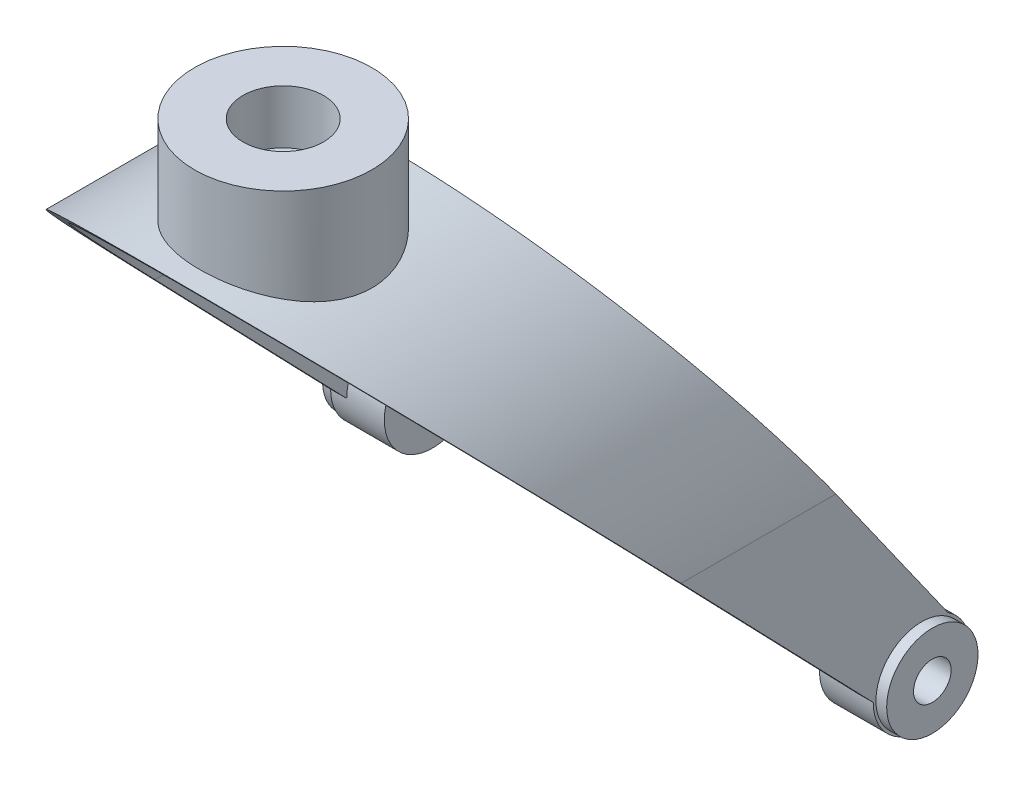
ISO-10303-21;
HEADER;
FILE_DESCRIPTION(('STEP AP214'),'2;1');
FILE_NAME('part.step','',(''),(''),'','','');
FILE_SCHEMA(('AUTOMOTIVE_DESIGN { 1 0 10303 214 1 1 1 1 }'));
ENDSEC;
DATA;
#1=APPLICATION_CONTEXT('core data for automotive mechanical design processes');
#2=APPLICATION_PROTOCOL_DEFINITION('international standard','automotive_design',2000,#1);
#3=PRODUCT_CONTEXT('',#1,'mechanical');
#4=PRODUCT('Part','Part','',(#3));
#5=PRODUCT_RELATED_PRODUCT_CATEGORY('part','',(#4));
#6=PRODUCT_DEFINITION_FORMATION('','',#4);
#7=PRODUCT_DEFINITION_CONTEXT('part definition',#1,'design');
#8=PRODUCT_DEFINITION('design','',#6,#7);
#9=PRODUCT_DEFINITION_SHAPE('','',#8);
#10=(LENGTH_UNIT() NAMED_UNIT(*) SI_UNIT(.MILLI.,.METRE.));
#11=(NAMED_UNIT(*) PLANE_ANGLE_UNIT() SI_UNIT($,.RADIAN.));
#12=(NAMED_UNIT(*) SI_UNIT($,.STERADIAN.) SOLID_ANGLE_UNIT());
#13=UNCERTAINTY_MEASURE_WITH_UNIT(LENGTH_MEASURE(1.E-05),#10,'distance_accuracy_value','');
#14=(GEOMETRIC_REPRESENTATION_CONTEXT(3) GLOBAL_UNCERTAINTY_ASSIGNED_CONTEXT((#13)) GLOBAL_UNIT_ASSIGNED_CONTEXT((#10,
#11,#12)) REPRESENTATION_CONTEXT('',''));
#15=CARTESIAN_POINT('',(0.,0.,0.));
#16=DIRECTION('',(0.,0.,1.));
#17=DIRECTION('',(1.,0.,0.));
#18=AXIS2_PLACEMENT_3D('',#15,#16,#17);
#19=CARTESIAN_POINT('',(-21.3589278020558,9.46327014218011,9.));
#20=DIRECTION('',(-1.,0.,0.));
#21=DIRECTION('',(0.,-1.,0.));
#22=AXIS2_PLACEMENT_3D('',#19,#20,#21);
#23=CYLINDRICAL_SURFACE('',#22,9.);
#24=CARTESIAN_POINT('',(-21.3589278020558,9.46327014218011,9.));
#25=DIRECTION('',(1.,0.,0.));
#26=DIRECTION('',(0.,1.,0.));
#27=AXIS2_PLACEMENT_3D('',#24,#25,#26);
#28=CIRCLE('',#27,9.);
#29=CARTESIAN_POINT('',(-21.3589278020558,18.4632701421801,9.));
#30=VERTEX_POINT('',#29);
#31=EDGE_CURVE('E520',#30,#30,#28,.T.);
#32=ORIENTED_EDGE('',*,*,#31,.F.);
#33=EDGE_LOOP('',(#32));
#34=FACE_BOUND('',#33,.T.);
#35=DIRECTION('',(-1.,0.,0.));
#36=VECTOR('',#35,1.);
#37=CARTESIAN_POINT('',(-21.3589278020558,17.0181657374201,4.10882912330557));
#38=LINE('',#37,#36);
#39=CARTESIAN_POINT('',(-31.3589278020558,17.0181657374201,4.10882912330557));
#40=VERTEX_POINT('',#39);
#41=CARTESIAN_POINT('',(-28.3589278020558,17.0181657374201,4.10882912330557));
#42=VERTEX_POINT('',#41);
#43=EDGE_CURVE('E142',#40,#42,#38,.F.);
#44=ORIENTED_EDGE('',*,*,#43,.T.);
#45=CARTESIAN_POINT('',(-28.3589278020558,9.46327014218011,9.));
#46=DIRECTION('',(-1.,0.,0.));
#47=DIRECTION('',(0.,-1.,0.));
#48=AXIS2_PLACEMENT_3D('',#45,#46,#47);
#49=CIRCLE('',#48,9.);
#50=CARTESIAN_POINT('',(-28.3589278020558,9.4632701421801,18.));
#51=VERTEX_POINT('',#50);
#52=EDGE_CURVE('E518',#42,#51,#49,.F.);
#53=ORIENTED_EDGE('',*,*,#52,.T.);
#54=DIRECTION('',(1.,0.,0.));
#55=VECTOR('',#54,1.);
#56=CARTESIAN_POINT('',(-71.3589278020558,9.4632701421801,18.));
#57=LINE('',#56,#55);
#58=CARTESIAN_POINT('',(-31.3589278020558,9.46327014218009,18.));
#59=VERTEX_POINT('',#58);
#60=EDGE_CURVE('E501',#59,#51,#57,.T.);
#61=ORIENTED_EDGE('',*,*,#60,.F.);
#62=CARTESIAN_POINT('',(-31.3589278020558,9.46327014218011,9.));
#63=DIRECTION('',(1.,0.,0.));
#64=DIRECTION('',(0.,1.,0.));
#65=AXIS2_PLACEMENT_3D('',#62,#63,#64);
#66=CIRCLE('',#65,9.);
#67=EDGE_CURVE('E521',#59,#40,#66,.T.);
#68=ORIENTED_EDGE('',*,*,#67,.T.);
#69=EDGE_LOOP('',(#44,#53,#61,#68));
#70=FACE_BOUND('',#69,.T.);
#71=ADVANCED_FACE('F37',(#34,#70),#23,.T.);
#72=CARTESIAN_POINT('',(-31.3589278020558,46.5431107748374,100.));
#73=DIRECTION('',(1.,0.,0.));
#74=DIRECTION('',(0.,0.,-1.));
#75=AXIS2_PLACEMENT_3D('',#72,#73,#74);
#76=PLANE('',#75);
#77=DIRECTION('',(0.,0.816967863264762,0.576683197598655));
#78=VECTOR('',#77,1.);
#79=CARTESIAN_POINT('',(-31.3589278020558,3.72382153587565,-5.2754138424905));
#80=LINE('',#79,#78);
#81=CARTESIAN_POINT('',(-31.3589278020558,46.5431107748374,24.9499667967766));
#82=VERTEX_POINT('',#81);
#83=EDGE_CURVE('E60',#40,#82,#80,.T.);
#84=ORIENTED_EDGE('',*,*,#83,.F.);
#85=ORIENTED_EDGE('',*,*,#67,.F.);
#86=DIRECTION('',(0.,0.719693182251275,0.694292246407112));
#87=VECTOR('',#86,1.);
#88=CARTESIAN_POINT('',(-31.3589278020558,69.6426269828819,76.0553795404417));
#89=LINE('',#88,#87);
#90=CARTESIAN_POINT('',(-31.3589278020558,46.5431107748374,53.7711403750341));
#91=VERTEX_POINT('',#90);
#92=EDGE_CURVE('E492',#59,#91,#89,.T.);
#93=ORIENTED_EDGE('',*,*,#92,.T.);
#94=DIRECTION('',(0.,0.,-1.));
#95=VECTOR('',#94,1.);
#96=CARTESIAN_POINT('',(-31.3589278020558,46.5431107748374,100.));
#97=LINE('',#96,#95);
#98=EDGE_CURVE('E485',#91,#82,#97,.T.);
#99=ORIENTED_EDGE('',*,*,#98,.T.);
#100=EDGE_LOOP('',(#84,#85,#93,#99));
#101=FACE_BOUND('',#100,.T.);
#102=CARTESIAN_POINT('',(-31.3589278020558,9.46327014218011,9.));
#103=DIRECTION('',(1.,0.,0.));
#104=DIRECTION('',(0.,1.,0.));
#105=AXIS2_PLACEMENT_3D('',#102,#103,#104);
#106=CIRCLE('',#105,8.5);
#107=CARTESIAN_POINT('',(-31.3589278020558,17.9632701421801,9.));
#108=VERTEX_POINT('',#107);
#109=EDGE_CURVE('E526',#108,#108,#106,.T.);
#110=ORIENTED_EDGE('',*,*,#109,.T.);
#111=EDGE_LOOP('',(#110));
#112=FACE_BOUND('',#111,.T.);
#113=ADVANCED_FACE('F186',(#101,#112),#76,.F.);
#114=CARTESIAN_POINT('',(0.,3.72382153587565,-5.2754138424905));
#115=DIRECTION('',(0.,0.576683197598655,-0.816967863264762));
#116=DIRECTION('',(0.,0.816967863264762,0.576683197598655));
#117=AXIS2_PLACEMENT_3D('',#114,#115,#116);
#118=PLANE('',#117);
#119=ORIENTED_EDGE('',*,*,#83,.T.);
#120=CARTESIAN_POINT('',(19.1410721979442,43.8938256977357,23.0798832129401));
#121=DIRECTION('',(0.,0.576683197598655,-0.816967863264762));
#122=DIRECTION('',(0.,-0.816967863264762,-0.576683197598655));
#123=AXIS2_PLACEMENT_3D('',#120,#121,#122);
#124=ELLIPSE('',#123,61.8989396258002,50.5694444444444);
#125=CARTESIAN_POINT('',(69.6410721979442,46.5431107748371,24.9499667967764));
#126=VERTEX_POINT('',#125);
#127=EDGE_CURVE('E12',#82,#126,#124,.T.);
#128=ORIENTED_EDGE('',*,*,#127,.T.);
#129=DIRECTION('',(0.,-0.816967863264762,-0.576683197598655));
#130=VECTOR('',#129,1.);
#131=CARTESIAN_POINT('',(69.6410721979442,3.72382153587566,-5.27541384249051));
#132=LINE('',#131,#130);
#133=CARTESIAN_POINT('',(69.6410721979442,17.0181657374201,4.10882912330555));
#134=VERTEX_POINT('',#133);
#135=EDGE_CURVE('E126',#126,#134,#132,.T.);
#136=ORIENTED_EDGE('',*,*,#135,.T.);
#137=DIRECTION('',(-1.,0.,0.));
#138=VECTOR('',#137,1.);
#139=CARTESIAN_POINT('',(-21.3589278020558,17.0181657374201,4.10882912330557));
#140=LINE('',#139,#138);
#141=CARTESIAN_POINT('',(66.6410721979442,17.0181657374201,4.10882912330557));
#142=VERTEX_POINT('',#141);
#143=EDGE_CURVE('E134',#134,#142,#140,.T.);
#144=ORIENTED_EDGE('',*,*,#143,.T.);
#145=DIRECTION('',(0.,0.816967863264762,0.576683197598655));
#146=VECTOR('',#145,1.);
#147=CARTESIAN_POINT('',(66.6410721979442,3.72382153587566,-5.2754138424905));
#148=LINE('',#147,#146);
#149=CARTESIAN_POINT('',(66.6410721979442,47.0399533397788,25.3006791955587));
#150=VERTEX_POINT('',#149);
#151=EDGE_CURVE('E116',#142,#150,#148,.T.);
#152=ORIENTED_EDGE('',*,*,#151,.T.);
#153=CARTESIAN_POINT('',(19.1410721979442,26.7326091820951,10.9660833195467));
#154=DIRECTION('',(0.,0.576683197598655,-0.816967863264762));
#155=DIRECTION('',(0.,0.816967863264762,0.576683197598655));
#156=AXIS2_PLACEMENT_3D('',#153,#154,#155);
#157=CIRCLE('',#156,53.6108092241405);
#158=CARTESIAN_POINT('',(-28.3589278020558,47.0399533397788,25.3006791955588));
#159=VERTEX_POINT('',#158);
#160=EDGE_CURVE('E165',#159,#150,#157,.T.);
#161=ORIENTED_EDGE('',*,*,#160,.F.);
#162=DIRECTION('',(0.,-0.816967863264762,-0.576683197598655));
#163=VECTOR('',#162,1.);
#164=CARTESIAN_POINT('',(-28.3589278020558,3.72382153587564,-5.2754138424905));
#165=LINE('',#164,#163);
#166=EDGE_CURVE('E52',#159,#42,#165,.T.);
#167=ORIENTED_EDGE('',*,*,#166,.T.);
#168=ORIENTED_EDGE('',*,*,#43,.F.);
#169=EDGE_LOOP('',(#119,#128,#136,#144,#152,#161,#167,#168));
#170=FACE_BOUND('',#169,.T.);
#171=ADVANCED_FACE('F140',(#170),#118,.T.);
#172=CARTESIAN_POINT('',(19.1410721979442,43.8938256977357,100.));
#173=DIRECTION('',(0.,0.,-1.));
#174=DIRECTION('',(-1.,0.,0.));
#175=AXIS2_PLACEMENT_3D('',#172,#173,#174);
#176=CYLINDRICAL_SURFACE('',#175,47.5694444444444);
#177=CARTESIAN_POINT('',(19.1410721979442,43.8938256977357,25.5279599243148));
#178=DIRECTION('',(0.,0.576683197598655,-0.816967863264762));
#179=DIRECTION('',(0.,-0.816967863264762,-0.576683197598655));
#180=AXIS2_PLACEMENT_3D('',#177,#178,#179);
#181=ELLIPSE('',#180,58.2268245587381,47.5694444444444);
#182=CARTESIAN_POINT('',(66.6410721979442,46.4632701421801,27.3416854145108));
#183=VERTEX_POINT('',#182);
#184=CARTESIAN_POINT('',(-28.3589278020558,46.4632701421801,27.3416854145109));
#185=VERTEX_POINT('',#184);
#186=EDGE_CURVE('E471',#183,#185,#181,.F.);
#187=ORIENTED_EDGE('',*,*,#186,.F.);
#188=DIRECTION('',(0.,0.,-1.));
#189=VECTOR('',#188,1.);
#190=CARTESIAN_POINT('',(66.6410721979442,46.4632701421801,100.));
#191=LINE('',#190,#189);
#192=CARTESIAN_POINT('',(66.6410721979442,46.4632701421801,53.6941176470588));
#193=VERTEX_POINT('',#192);
#194=EDGE_CURVE('E474',#193,#183,#191,.T.);
#195=ORIENTED_EDGE('',*,*,#194,.F.);
#196=CARTESIAN_POINT('',(19.1410721979442,43.8938256977357,51.2153594771242));
#197=DIRECTION('',(0.,0.694292246407112,-0.719693182251275));
#198=DIRECTION('',(0.,-0.719693182251275,-0.694292246407112));
#199=AXIS2_PLACEMENT_3D('',#196,#197,#198);
#200=ELLIPSE('',#199,66.0968390663954,47.5694444444444);
#201=CARTESIAN_POINT('',(-28.3589278020558,46.4632701421801,53.6941176470588));
#202=VERTEX_POINT('',#201);
#203=EDGE_CURVE('E496',#193,#202,#200,.F.);
#204=ORIENTED_EDGE('',*,*,#203,.T.);
#205=DIRECTION('',(0.,0.,-1.));
#206=VECTOR('',#205,1.);
#207=CARTESIAN_POINT('',(-28.3589278020558,46.4632701421801,100.));
#208=LINE('',#207,#206);
#209=EDGE_CURVE('E476',#202,#185,#208,.T.);
#210=ORIENTED_EDGE('',*,*,#209,.T.);
#211=EDGE_LOOP('',(#187,#195,#204,#210));
#212=FACE_BOUND('',#211,.T.);
#213=ADVANCED_FACE('F39',(#212),#176,.F.);
#214=CARTESIAN_POINT('',(-28.3589278020558,46.4632701421801,100.));
#215=DIRECTION('',(-1.,0.,0.));
#216=DIRECTION('',(0.,-1.,0.));
#217=AXIS2_PLACEMENT_3D('',#214,#215,#216);
#218=PLANE('',#217);
#219=ORIENTED_EDGE('',*,*,#52,.F.);
#220=ORIENTED_EDGE('',*,*,#166,.F.);
#221=DIRECTION('',(0.,-0.576683197598655,0.816967863264762));
#222=VECTOR('',#221,1.);
#223=CARTESIAN_POINT('',(-28.3589278020558,47.0399533397788,25.3006791955588));
#224=LINE('',#223,#222);
#225=CARTESIAN_POINT('',(-28.3589278020558,45.8865869445815,26.9346149220883));
#226=VERTEX_POINT('',#225);
#227=EDGE_CURVE('E479',#159,#226,#224,.T.);
#228=ORIENTED_EDGE('',*,*,#227,.T.);
#229=DIRECTION('',(0.,-0.816967863264762,-0.576683197598655));
#230=VECTOR('',#229,1.);
#231=CARTESIAN_POINT('',(-28.3589278020558,80.6949010323413,51.5051895722717));
#232=LINE('',#231,#230);
#233=EDGE_CURVE('E537',#185,#226,#232,.T.);
#234=ORIENTED_EDGE('',*,*,#233,.F.);
#235=ORIENTED_EDGE('',*,*,#209,.F.);
#236=DIRECTION('',(0.,-0.719693182251275,-0.694292246407112));
#237=VECTOR('',#236,1.);
#238=CARTESIAN_POINT('',(-28.3589278020558,69.6012728663897,76.0154849810022));
#239=LINE('',#238,#237);
#240=EDGE_CURVE('E498',#202,#51,#239,.T.);
#241=ORIENTED_EDGE('',*,*,#240,.T.);
#242=EDGE_LOOP('',(#219,#220,#228,#234,#235,#241));
#243=FACE_BOUND('',#242,.T.);
#244=ADVANCED_FACE('F223',(#243),#218,.F.);
#245=CARTESIAN_POINT('',(66.6410721979442,46.4632701421801,100.));
#246=DIRECTION('',(1.,0.,0.));
#247=DIRECTION('',(0.,1.,0.));
#248=AXIS2_PLACEMENT_3D('',#245,#246,#247);
#249=PLANE('',#248);
#250=CARTESIAN_POINT('',(66.6410721979442,9.46327014218012,9.));
#251=DIRECTION('',(1.,0.,0.));
#252=DIRECTION('',(0.,1.,0.));
#253=AXIS2_PLACEMENT_3D('',#250,#251,#252);
#254=CIRCLE('',#253,9.);
#255=CARTESIAN_POINT('',(66.6410721979442,9.46327014218013,18.));
#256=VERTEX_POINT('',#255);
#257=EDGE_CURVE('E120',#142,#256,#254,.T.);
#258=ORIENTED_EDGE('',*,*,#257,.T.);
#259=DIRECTION('',(0.,0.719693182251275,0.694292246407112));
#260=VECTOR('',#259,1.);
#261=CARTESIAN_POINT('',(66.6410721979442,69.6012728663897,76.0154849810022));
#262=LINE('',#261,#260);
#263=EDGE_CURVE('E481',#256,#193,#262,.T.);
#264=ORIENTED_EDGE('',*,*,#263,.T.);
#265=ORIENTED_EDGE('',*,*,#194,.T.);
#266=DIRECTION('',(0.,0.816967863264762,0.576683197598655));
#267=VECTOR('',#266,1.);
#268=CARTESIAN_POINT('',(66.6410721979442,80.6949010323413,51.5051895722717));
#269=LINE('',#268,#267);
#270=CARTESIAN_POINT('',(66.6410721979442,45.8865869445815,26.9346149220883));
#271=VERTEX_POINT('',#270);
#272=EDGE_CURVE('E478',#271,#183,#269,.T.);
#273=ORIENTED_EDGE('',*,*,#272,.F.);
#274=DIRECTION('',(0.,-0.576683197598655,0.816967863264762));
#275=VECTOR('',#274,1.);
#276=CARTESIAN_POINT('',(66.6410721979442,47.0399533397788,25.3006791955587));
#277=LINE('',#276,#275);
#278=EDGE_CURVE('E123',#150,#271,#277,.T.);
#279=ORIENTED_EDGE('',*,*,#278,.F.);
#280=ORIENTED_EDGE('',*,*,#151,.F.);
#281=EDGE_LOOP('',(#258,#264,#265,#273,#279,#280));
#282=FACE_BOUND('',#281,.T.);
#283=ADVANCED_FACE('F118',(#282),#249,.F.);
#284=CARTESIAN_POINT('',(-71.3589278020558,94.4632701421801,100.));
#285=DIRECTION('',(0.,0.694292246407112,-0.719693182251275));
#286=DIRECTION('',(0.,0.719693182251275,0.694292246407112));
#287=AXIS2_PLACEMENT_3D('',#284,#285,#286);
#288=PLANE('',#287);
#289=CARTESIAN_POINT('',(19.1410721979442,43.8938256977357,51.2153594771242));
#290=DIRECTION('',(0.,0.694292246407112,-0.719693182251275));
#291=DIRECTION('',(0.,-0.719693182251275,-0.694292246407112));
#292=AXIS2_PLACEMENT_3D('',#289,#290,#291);
#293=ELLIPSE('',#292,70.2652820556921,50.5694444444444);
#294=CARTESIAN_POINT('',(69.6410721979442,46.5431107748371,53.7711403750338));
#295=VERTEX_POINT('',#294);
#296=EDGE_CURVE('E490',#91,#295,#293,.T.);
#297=ORIENTED_EDGE('',*,*,#296,.F.);
#298=ORIENTED_EDGE('',*,*,#92,.F.);
#299=ORIENTED_EDGE('',*,*,#60,.T.);
#300=ORIENTED_EDGE('',*,*,#240,.F.);
#301=ORIENTED_EDGE('',*,*,#203,.F.);
#302=ORIENTED_EDGE('',*,*,#263,.F.);
#303=CARTESIAN_POINT('',(69.6410721979442,9.46327014218013,18.));
#304=VERTEX_POINT('',#303);
#305=EDGE_CURVE('E136',#256,#304,#57,.T.);
#306=ORIENTED_EDGE('',*,*,#305,.T.);
#307=DIRECTION('',(0.,0.719693182251275,0.694292246407112));
#308=VECTOR('',#307,1.);
#309=CARTESIAN_POINT('',(69.6410721979442,94.4632701421801,100.));
#310=LINE('',#309,#308);
#311=EDGE_CURVE('E137',#304,#295,#310,.T.);
#312=ORIENTED_EDGE('',*,*,#311,.T.);
#313=EDGE_LOOP('',(#297,#298,#299,#300,#301,#302,#306,#312));
#314=FACE_BOUND('',#313,.T.);
#315=ADVANCED_FACE('F218',(#314),#288,.F.);
#316=CARTESIAN_POINT('',(69.6410721979442,46.5431107748373,100.));
#317=DIRECTION('',(-1.,0.,0.));
#318=DIRECTION('',(0.,-1.,0.));
#319=AXIS2_PLACEMENT_3D('',#316,#317,#318);
#320=PLANE('',#319);
#321=CARTESIAN_POINT('',(69.6410721979442,9.46327014218012,9.));
#322=DIRECTION('',(1.,0.,0.));
#323=DIRECTION('',(0.,1.,0.));
#324=AXIS2_PLACEMENT_3D('',#321,#322,#323);
#325=CIRCLE('',#324,9.);
#326=EDGE_CURVE('E505',#304,#134,#325,.T.);
#327=ORIENTED_EDGE('',*,*,#326,.T.);
#328=ORIENTED_EDGE('',*,*,#135,.F.);
#329=DIRECTION('',(0.,0.,-1.));
#330=VECTOR('',#329,1.);
#331=CARTESIAN_POINT('',(69.6410721979442,46.5431107748373,100.));
#332=LINE('',#331,#330);
#333=EDGE_CURVE('E482',#295,#126,#332,.T.);
#334=ORIENTED_EDGE('',*,*,#333,.F.);
#335=ORIENTED_EDGE('',*,*,#311,.F.);
#336=EDGE_LOOP('',(#327,#328,#334,#335));
#337=FACE_BOUND('',#336,.T.);
#338=CARTESIAN_POINT('',(69.6410721979442,9.46327014218012,9.));
#339=DIRECTION('',(-1.,0.,0.));
#340=DIRECTION('',(0.,-1.,0.));
#341=AXIS2_PLACEMENT_3D('',#338,#339,#340);
#342=CIRCLE('',#341,8.5);
#343=CARTESIAN_POINT('',(69.6410721979442,0.963270142180122,9.));
#344=VERTEX_POINT('',#343);
#345=EDGE_CURVE('E45',#344,#344,#342,.F.);
#346=ORIENTED_EDGE('',*,*,#345,.F.);
#347=EDGE_LOOP('',(#346));
#348=FACE_BOUND('',#347,.T.);
#349=ADVANCED_FACE('F221',(#337,#348),#320,.F.);
#350=CARTESIAN_POINT('',(19.1410721979442,43.8938256977357,100.));
#351=DIRECTION('',(0.,0.,-1.));
#352=DIRECTION('',(-1.,0.,0.));
#353=AXIS2_PLACEMENT_3D('',#350,#351,#352);
#354=CYLINDRICAL_SURFACE('',#353,50.5694444444444);
#355=CARTESIAN_POINT('',(21.175045512011,94.4223489690269,95.8537996069342));
#356=CARTESIAN_POINT('',(21.6293911688687,94.4040593578291,95.8537990620842));
#357=CARTESIAN_POINT('',(22.0834983225112,94.3796275101708,95.8350174938615));
#358=CARTESIAN_POINT('',(22.987825012467,94.3187859229245,95.7601917686414));
#359=CARTESIAN_POINT('',(23.4380444232531,94.2823757980558,95.7041464129972));
#360=CARTESIAN_POINT('',(24.3314070006087,94.1982041036072,95.5554194525407));
#361=CARTESIAN_POINT('',(24.77454858049,94.1504400258135,95.4627297495819));
#362=CARTESIAN_POINT('',(25.6505486092346,94.0444996665033,95.2416548563205));
#363=CARTESIAN_POINT('',(26.0834070834208,93.9863234106306,95.1132697539306));
#364=CARTESIAN_POINT('',(26.9350960638251,93.8608831362379,94.8222814190405));
#365=CARTESIAN_POINT('',(27.353953186574,93.793637747517,94.6597479619422));
#366=CARTESIAN_POINT('',(28.1759235994888,93.6513795226166,94.3016650159253));
#367=CARTESIAN_POINT('',(28.5790369133806,93.5763666981434,94.1061155767644));
#368=CARTESIAN_POINT('',(29.3671000191722,93.4201665739857,93.6834944346041));
#369=CARTESIAN_POINT('',(29.7520505625456,93.3389795301195,93.4564240373005));
#370=CARTESIAN_POINT('',(30.501736892762,93.1721328408972,92.9722439534172));
#371=CARTESIAN_POINT('',(30.8664653648255,93.0864715986023,92.715123500233));
#372=CARTESIAN_POINT('',(31.5860116366797,92.909479002438,92.1629614714776));
#373=CARTESIAN_POINT('',(31.9400257862623,92.8180542280665,91.8669020532057));
#374=CARTESIAN_POINT('',(32.6219473151987,92.6345624768142,91.2462763297515));
#375=CARTESIAN_POINT('',(32.9498539283629,92.542495481172,90.9217091885278));
#376=CARTESIAN_POINT('',(33.5776774320152,92.3598971277117,90.2458851014081));
#377=CARTESIAN_POINT('',(33.8775829491797,92.2693664059996,89.8946174146227));
#378=CARTESIAN_POINT('',(34.4472143491486,92.0921626804185,89.1677019886894));
#379=CARTESIAN_POINT('',(34.716951006541,92.0054883059861,88.7920630297847));
#380=CARTESIAN_POINT('',(35.2305055606759,91.8362254301379,88.0093344097203));
#381=CARTESIAN_POINT('',(35.4735585148377,91.7537822701251,87.6017106560844));
#382=CARTESIAN_POINT('',(35.9242513360906,91.5976046485722,86.7657107455564));
#383=CARTESIAN_POINT('',(36.1318904033653,91.5238703837325,86.3373341202449));
#384=CARTESIAN_POINT('',(36.5098355888625,91.3873532648053,85.4628909184144));
#385=CARTESIAN_POINT('',(36.6801544059876,91.3245666870555,85.0168304203602));
#386=CARTESIAN_POINT('',(36.9818602213691,91.2119085960766,84.1101469066));
#387=CARTESIAN_POINT('',(37.1132495409578,91.1620363128016,83.6495247610059));
#388=CARTESIAN_POINT('',(37.3304901109242,91.0788516870751,82.7391041726174));
#389=CARTESIAN_POINT('',(37.418181948516,91.0448745806625,82.2898053180916));
#390=CARTESIAN_POINT('',(37.5559877388122,90.9912257447694,81.3846330689346));
#391=CARTESIAN_POINT('',(37.6061028284869,90.9715535824606,80.9287598736507));
#392=CARTESIAN_POINT('',(37.6681939811901,90.9471527602003,80.0141633436236));
#393=CARTESIAN_POINT('',(37.6801816635216,90.9424195476167,79.5554409198879));
#394=CARTESIAN_POINT('',(37.6659144524495,90.9480390780561,78.6386916707866));
#395=CARTESIAN_POINT('',(37.6396607504055,90.9583913511109,78.1806648241963));
#396=CARTESIAN_POINT('',(37.5516320742204,90.992892195023,77.2933512209981));
#397=CARTESIAN_POINT('',(37.4918308656593,91.0162737202683,76.8638369234162));
#398=CARTESIAN_POINT('',(37.3388247085076,91.0755725783902,76.0117020623166));
#399=CARTESIAN_POINT('',(37.2456211594406,91.1114893860496,75.5890812107463));
#400=CARTESIAN_POINT('',(37.0266627756634,91.1948622841428,74.7534956031722));
#401=CARTESIAN_POINT('',(36.9009049442454,91.2423194368714,74.3405317399375));
#402=CARTESIAN_POINT('',(36.6179251499722,91.3474987412205,73.5268781409416));
#403=CARTESIAN_POINT('',(36.4607021957824,91.4052212162522,73.1261887923578));
#404=CARTESIAN_POINT('',(36.1124903053262,91.5307295804632,72.3313456889186));
#405=CARTESIAN_POINT('',(35.920872857619,91.5986981826697,71.9374963094857));
#406=CARTESIAN_POINT('',(35.5076090229701,91.7420544551533,71.167308757406));
#407=CARTESIAN_POINT('',(35.2859624407915,91.8174421736654,70.7909706986317));
#408=CARTESIAN_POINT('',(34.814097561475,91.9738294253859,70.0577589619996));
#409=CARTESIAN_POINT('',(34.563872230259,92.0548303382304,69.700890108167));
#410=CARTESIAN_POINT('',(34.0364490139345,92.2205560202046,69.0085738578664));
#411=CARTESIAN_POINT('',(33.7592493434134,92.3052810356263,68.6731278818007));
#412=CARTESIAN_POINT('',(33.1610716710181,92.4820097927103,68.0048422389572));
#413=CARTESIAN_POINT('',(32.8384315325991,92.5741341209855,67.6735204158947));
#414=CARTESIAN_POINT('',(32.1664618983836,92.7582225622966,67.0390808212548));
#415=CARTESIAN_POINT('',(31.8171313201082,92.8501866686794,66.7359641946967));
#416=CARTESIAN_POINT('',(31.0938141733286,93.0317917909571,66.1597915457807));
#417=CARTESIAN_POINT('',(30.7198229521095,93.1214323640017,65.8867412221165));
#418=CARTESIAN_POINT('',(29.9495029793164,93.2962801111632,65.3726224854755));
#419=CARTESIAN_POINT('',(29.5531751122038,93.3814874605652,65.1315528074309));
#420=CARTESIAN_POINT('',(28.7325445965825,93.5471337004156,64.6787139681657));
#421=CARTESIAN_POINT('',(28.3078435626223,93.627444862706,64.4676190271131));
#422=CARTESIAN_POINT('',(27.4405340268359,93.779509600526,64.0822959734368));
#423=CARTESIAN_POINT('',(26.9979251611905,93.8512630020773,63.9080686102712));
#424=CARTESIAN_POINT('',(26.0980367191719,93.9845051045841,63.598148268891));
#425=CARTESIAN_POINT('',(25.6407611363865,94.0459965719354,63.4624448985019));
#426=CARTESIAN_POINT('',(24.714838469502,94.1573235459859,63.2309101051919));
#427=CARTESIAN_POINT('',(24.2461919449684,94.2071596249693,63.1350767244587));
#428=CARTESIAN_POINT('',(23.3214017858216,94.2922372866855,62.9875860554944));
#429=CARTESIAN_POINT('',(22.8655798942799,94.3280116159013,62.9342156930801));
#430=CARTESIAN_POINT('',(21.9502796221452,94.3872644043694,62.8656338902988));
#431=CARTESIAN_POINT('',(21.4908013406286,94.4107431956474,62.8504214194829));
#432=CARTESIAN_POINT('',(20.5717989072636,94.4451178368554,62.8584301050564));
#433=CARTESIAN_POINT('',(20.1122747819547,94.4560161464438,62.8816437464472));
#434=CARTESIAN_POINT('',(19.1966508158529,94.4653119647631,62.9663858894303));
#435=CARTESIAN_POINT('',(18.7405509102605,94.4637097106525,63.0279136641135));
#436=CARTESIAN_POINT('',(17.8523150881573,94.4487233645544,63.185768321753));
#437=CARTESIAN_POINT('',(17.4199228139822,94.4357843879805,63.2807002593016));
#438=CARTESIAN_POINT('',(16.5645880372292,94.3994062729025,63.5048522098383));
#439=CARTESIAN_POINT('',(16.1416452507298,94.375967450326,63.6340711911233));
#440=CARTESIAN_POINT('',(15.3080436647309,94.3195250573189,63.9257956193019));
#441=CARTESIAN_POINT('',(14.8973854974149,94.2865209955788,64.0883027758854));
#442=CARTESIAN_POINT('',(14.0910401144201,94.2121111162162,64.4453689936925));
#443=CARTESIAN_POINT('',(13.6953532471888,94.1707051031862,64.6399288003576));
#444=CARTESIAN_POINT('',(12.9153141647787,94.080131136177,65.0630053971083));
#445=CARTESIAN_POINT('',(12.5312395316207,94.0308509572369,65.2920098053488));
#446=CARTESIAN_POINT('',(11.7834719385956,93.9265846206264,65.7800129833695));
#447=CARTESIAN_POINT('',(11.4197791015911,93.8715984285655,66.0390119339297));
#448=CARTESIAN_POINT('',(10.7148795820018,93.757595177237,66.5853302881275));
#449=CARTESIAN_POINT('',(10.373677712734,93.6985772606033,66.8726557213238));
#450=CARTESIAN_POINT('',(9.71585174571431,93.5782876578991,67.4737571752487));
#451=CARTESIAN_POINT('',(9.39922830597895,93.5170159115535,67.7875339036656));
#452=CARTESIAN_POINT('',(8.78016656045584,93.3915437968201,68.4528053517105));
#453=CARTESIAN_POINT('',(8.47881820156868,93.3273251218384,68.8053117715233));
#454=CARTESIAN_POINT('',(7.90672099169346,93.200457559158,69.5346157975976));
#455=CARTESIAN_POINT('',(7.63597298582948,93.1378087148522,69.9114140743032));
#456=CARTESIAN_POINT('',(7.12691198095222,93.0160934057932,70.6869040396555));
#457=CARTESIAN_POINT('',(6.88860064212898,92.9570271244902,71.0855968474546));
#458=CARTESIAN_POINT('',(6.44615248011799,92.8444116394972,71.9022642500852));
#459=CARTESIAN_POINT('',(6.24201534056743,92.7908623847359,72.3202386663742));
#460=CARTESIAN_POINT('',(5.86864238756045,92.690842731127,73.1746137363951));
#461=CARTESIAN_POINT('',(5.69956906569262,92.6444055394374,73.6110893632274));
#462=CARTESIAN_POINT('',(5.39890557845094,92.5605079019083,74.4976196424715));
#463=CARTESIAN_POINT('',(5.26731566066077,92.5230475153622,74.9476743845538));
#464=CARTESIAN_POINT('',(5.04282181260602,92.4584394582395,75.8579392254475));
#465=CARTESIAN_POINT('',(4.94990764770527,92.431289059532,76.3181466036131));
#466=CARTESIAN_POINT('',(4.80359045084082,92.3882704184725,77.2453171481667));
#467=CARTESIAN_POINT('',(4.75018598883651,92.3724017677823,77.7122800694163));
#468=CARTESIAN_POINT('',(4.68464041995619,92.352895017234,78.6319195912019));
#469=CARTESIAN_POINT('',(4.67104248867551,92.3488251656164,79.0844837762828));
#470=CARTESIAN_POINT('',(4.68107867491002,92.3518212380978,79.98915517628));
#471=CARTESIAN_POINT('',(4.70471185387034,92.3588868814834,80.4412624024282));
#472=CARTESIAN_POINT('',(4.78899082086468,92.3839112002155,81.3416814491257));
#473=CARTESIAN_POINT('',(4.849634837157,92.4018693541275,81.7899934503143));
#474=CARTESIAN_POINT('',(5.00739089104611,92.4480686124889,82.6796112895565));
#475=CARTESIAN_POINT('',(5.10450301841448,92.4763097422512,83.1209171103605));
#476=CARTESIAN_POINT('',(5.33276741434584,92.5416756192797,83.9873916219262));
#477=CARTESIAN_POINT('',(5.46343068734383,92.5786721976542,84.4126990431762));
#478=CARTESIAN_POINT('',(5.75836850560194,92.6605700682666,85.2506953348633));
#479=CARTESIAN_POINT('',(5.92264260481543,92.7054712556021,85.6633843726745));
#480=CARTESIAN_POINT('',(6.2836018852915,92.8017907089701,86.4736048550809));
#481=CARTESIAN_POINT('',(6.48029150734901,92.8532098677151,86.8711342136605));
#482=CARTESIAN_POINT('',(6.90470046624332,92.961002453674,87.648581778196));
#483=CARTESIAN_POINT('',(7.13242155557901,93.0173761606317,88.0284989878825));
#484=CARTESIAN_POINT('',(7.62549971974418,93.1353393588282,88.7808235232557));
#485=CARTESIAN_POINT('',(7.89185964105543,93.1970401587329,89.1525564313815));
#486=CARTESIAN_POINT('',(8.45435680817032,93.3220140972181,89.8724862018428));
#487=CARTESIAN_POINT('',(8.75049466622069,93.3852872681071,90.2206825800113));
#488=CARTESIAN_POINT('',(9.37073350539963,93.5114570637922,90.8914296811703));
#489=CARTESIAN_POINT('',(9.69484052433608,93.574353604134,91.2139748377129));
#490=CARTESIAN_POINT('',(10.3689375593372,93.6977989691979,91.831254818022));
#491=CARTESIAN_POINT('',(10.7189269456853,93.7583478509838,92.1259903179991));
#492=CARTESIAN_POINT('',(11.451415069209,93.8766107040007,92.6924850278058));
#493=CARTESIAN_POINT('',(11.8344964718165,93.9342202740701,92.9635134293924));
#494=CARTESIAN_POINT('',(12.6230199985914,94.0430239362251,93.4723344822066));
#495=CARTESIAN_POINT('',(13.0284627928162,94.094217835915,93.7101261367419));
#496=CARTESIAN_POINT('',(13.8587773669123,94.1883637956787,94.1505216857482));
#497=CARTESIAN_POINT('',(14.2836425072204,94.2313186465783,94.353137493174));
#498=CARTESIAN_POINT('',(15.1498728077757,94.3073953193643,94.7215832826493));
#499=CARTESIAN_POINT('',(15.5912367533937,94.3405178634986,94.8874159664359));
#500=CARTESIAN_POINT('',(16.4523250652327,94.3934367943271,95.1694542622437));
#501=CARTESIAN_POINT('',(16.8710651818128,94.4140688277027,95.2885152271419));
#502=CARTESIAN_POINT('',(17.7169957231221,94.4449860053703,95.4932307163543));
#503=CARTESIAN_POINT('',(18.1441856054993,94.4552718115562,95.5788873774748));
#504=CARTESIAN_POINT('',(19.0040676193441,94.4649121168414,95.7161462784396));
#505=CARTESIAN_POINT('',(19.4367590015482,94.464268088901,95.7677531060397));
#506=CARTESIAN_POINT('',(20.3047215789459,94.4517432437332,95.836580771847));
#507=CARTESIAN_POINT('',(20.7399928844721,94.4398619424386,95.853800128648));
#508=CARTESIAN_POINT('',(21.175045512011,94.4223489690269,95.8537996069342));
#509=B_SPLINE_CURVE_WITH_KNOTS('',3,(#355,#356,#357,#358,#359,#360,#361,#362,#363,#364,#365,
#366,#367,#368,#369,#370,#371,#372,#373,#374,#375,#376,#377,#378,#379,#380,#381,#382,#383,#384,
#385,#386,#387,#388,#389,#390,#391,#392,#393,#394,#395,#396,#397,#398,#399,#400,#401,#402,#403,
#404,#405,#406,#407,#408,#409,#410,#411,#412,#413,#414,#415,#416,#417,#418,#419,#420,#421,#422,
#423,#424,#425,#426,#427,#428,#429,#430,#431,#432,#433,#434,#435,#436,#437,#438,#439,#440,#441,
#442,#443,#444,#445,#446,#447,#448,#449,#450,#451,#452,#453,#454,#455,#456,#457,#458,#459,#460,
#461,#462,#463,#464,#465,#466,#467,#468,#469,#470,#471,#472,#473,#474,#475,#476,#477,#478,#479,
#480,#481,#482,#483,#484,#485,#486,#487,#488,#489,#490,#491,#492,#493,#494,#495,#496,#497,#498,
#499,#500,#501,#502,#503,#504,#505,#506,#507,#508),.UNSPECIFIED.,.T.,.F.,(4,2,2,2,2,2,2,2,2,2,2,
2,2,2,2,2,2,2,2,2,2,2,2,2,2,2,2,2,2,2,2,2,2,2,2,2,2,2,2,2,2,2,2,2,2,2,2,2,2,2,2,2,2,2,2,2,2,2,2,
2,2,2,2,2,2,2,2,2,2,2,2,2,2,2,2,2,4),(0.,1.36373166628534,2.72750720121297,4.09158428969093,
5.45565801867446,6.81697117786217,8.17828228546016,9.53953702015265,10.9012809813343,
12.3110684934117,13.7208973639099,15.1312964018439,16.5411901066825,17.9844676730775,
19.4277778313333,20.8705961114442,22.3133283402285,23.6886630696602,25.0639561835198,
26.4388301375007,27.8136612600215,29.1150023029237,30.4162888273523,31.7176951812678,
33.0191425435191,34.347383094386,35.6756322813289,37.0042090972055,38.3328739105366,
39.7459013282984,41.1589860843759,42.5723382137377,43.9856344180365,45.4268979139223,
46.868190705546,48.3090943259258,49.7499271825082,51.129176938676,52.5083894479772,
53.8873322564142,55.2662489038614,56.5933353033844,57.9203817751701,59.247496421525,
60.5746419366586,61.9227404949308,63.2708471787431,64.6192414418997,65.9676717919804,
67.3705816908145,68.7735303259127,70.1765507404634,71.5795581660324,72.9889288313031,
74.3983088054685,75.8073155826183,77.216271358739,78.5729752587021,79.9296449582163,
81.2862497178389,82.6428578169643,83.9807171069343,85.3185586434311,86.6565836113688,
87.9946841754681,89.3774678174704,90.7602798958934,92.1433912374981,93.5264689391502,
94.9430977895921,96.3597691123042,97.7759597129971,99.192046259378,100.498072639345,
101.804015461719,103.109782289961,104.415605369197),.UNSPECIFIED.);
#510=CARTESIAN_POINT('',(21.175045512011,94.4223489690269,95.8537996069342));
#511=VERTEX_POINT('',#510);
#512=EDGE_CURVE('E156',#511,#511,#509,.T.);
#513=ORIENTED_EDGE('',*,*,#512,.F.);
#514=EDGE_LOOP('',(#513));
#515=FACE_BOUND('',#514,.T.);
#516=ORIENTED_EDGE('',*,*,#296,.T.);
#517=ORIENTED_EDGE('',*,*,#333,.T.);
#518=ORIENTED_EDGE('',*,*,#127,.F.);
#519=ORIENTED_EDGE('',*,*,#98,.F.);
#520=EDGE_LOOP('',(#516,#517,#518,#519));
#521=FACE_BOUND('',#520,.T.);
#522=ADVANCED_FACE('F217',(#515,#521),#354,.T.);
#523=CARTESIAN_POINT('',(59.6410721979442,9.46327014218012,9.));
#524=DIRECTION('',(1.,0.,0.));
#525=DIRECTION('',(0.,1.,0.));
#526=AXIS2_PLACEMENT_3D('',#523,#524,#525);
#527=CYLINDRICAL_SURFACE('',#526,9.);
#528=ORIENTED_EDGE('',*,*,#143,.F.);
#529=ORIENTED_EDGE('',*,*,#326,.F.);
#530=ORIENTED_EDGE('',*,*,#305,.F.);
#531=ORIENTED_EDGE('',*,*,#257,.F.);
#532=EDGE_LOOP('',(#528,#529,#530,#531));
#533=FACE_BOUND('',#532,.T.);
#534=CARTESIAN_POINT('',(59.6410721979442,9.46327014218012,9.));
#535=DIRECTION('',(1.,0.,0.));
#536=DIRECTION('',(0.,1.,0.));
#537=AXIS2_PLACEMENT_3D('',#534,#535,#536);
#538=CIRCLE('',#537,9.);
#539=CARTESIAN_POINT('',(59.6410721979442,18.4632701421801,9.));
#540=VERTEX_POINT('',#539);
#541=EDGE_CURVE('E138',#540,#540,#538,.T.);
#542=ORIENTED_EDGE('',*,*,#541,.T.);
#543=EDGE_LOOP('',(#542));
#544=FACE_BOUND('',#543,.T.);
#545=ADVANCED_FACE('F131',(#533,#544),#527,.T.);
#546=CARTESIAN_POINT('',(59.6410721979442,9.46327014218012,9.));
#547=DIRECTION('',(1.,0.,0.));
#548=DIRECTION('',(0.,1.,0.));
#549=AXIS2_PLACEMENT_3D('',#546,#547,#548);
#550=PLANE('',#549);
#551=CARTESIAN_POINT('',(59.6410721979442,9.46327014218012,9.));
#552=DIRECTION('',(1.,0.,0.));
#553=DIRECTION('',(0.,1.,0.));
#554=AXIS2_PLACEMENT_3D('',#551,#552,#553);
#555=CIRCLE('',#554,3.5);
#556=CARTESIAN_POINT('',(59.6410721979442,12.9632701421801,9.));
#557=VERTEX_POINT('',#556);
#558=EDGE_CURVE('E512',#557,#557,#555,.T.);
#559=ORIENTED_EDGE('',*,*,#558,.T.);
#560=EDGE_LOOP('',(#559));
#561=FACE_BOUND('',#560,.T.);
#562=ORIENTED_EDGE('',*,*,#541,.F.);
#563=EDGE_LOOP('',(#562));
#564=FACE_BOUND('',#563,.T.);
#565=ADVANCED_FACE('F210',(#561,#564),#550,.F.);
#566=CARTESIAN_POINT('',(71.6410721979442,9.46327014218012,9.));
#567=DIRECTION('',(-1.,0.,0.));
#568=DIRECTION('',(0.,-1.,0.));
#569=AXIS2_PLACEMENT_3D('',#566,#567,#568);
#570=CYLINDRICAL_SURFACE('',#569,8.5);
#571=CARTESIAN_POINT('',(71.6410721979442,9.46327014218012,9.));
#572=DIRECTION('',(1.,0.,0.));
#573=DIRECTION('',(0.,1.,0.));
#574=AXIS2_PLACEMENT_3D('',#571,#572,#573);
#575=CIRCLE('',#574,8.5);
#576=CARTESIAN_POINT('',(71.6410721979442,17.9632701421801,9.));
#577=VERTEX_POINT('',#576);
#578=EDGE_CURVE('E507',#577,#577,#575,.T.);
#579=ORIENTED_EDGE('',*,*,#578,.F.);
#580=EDGE_LOOP('',(#579));
#581=FACE_BOUND('',#580,.T.);
#582=ORIENTED_EDGE('',*,*,#345,.T.);
#583=EDGE_LOOP('',(#582));
#584=FACE_BOUND('',#583,.T.);
#585=ADVANCED_FACE('F206',(#581,#584),#570,.T.);
#586=CARTESIAN_POINT('',(71.6410721979442,9.46327014218012,9.));
#587=DIRECTION('',(1.,0.,0.));
#588=DIRECTION('',(0.,1.,0.));
#589=AXIS2_PLACEMENT_3D('',#586,#587,#588);
#590=PLANE('',#589);
#591=CARTESIAN_POINT('',(71.6410721979442,9.46327014218012,9.));
#592=DIRECTION('',(1.,0.,0.));
#593=DIRECTION('',(0.,1.,0.));
#594=AXIS2_PLACEMENT_3D('',#591,#592,#593);
#595=CIRCLE('',#594,3.5);
#596=CARTESIAN_POINT('',(71.6410721979442,12.9632701421801,9.));
#597=VERTEX_POINT('',#596);
#598=EDGE_CURVE('E515',#597,#597,#595,.T.);
#599=ORIENTED_EDGE('',*,*,#598,.F.);
#600=EDGE_LOOP('',(#599));
#601=FACE_BOUND('',#600,.T.);
#602=ORIENTED_EDGE('',*,*,#578,.T.);
#603=EDGE_LOOP('',(#602));
#604=FACE_BOUND('',#603,.T.);
#605=ADVANCED_FACE('F202',(#601,#604),#590,.T.);
#606=CARTESIAN_POINT('',(57.6410721979442,9.46327014218012,9.));
#607=DIRECTION('',(1.,0.,0.));
#608=DIRECTION('',(0.,1.,0.));
#609=AXIS2_PLACEMENT_3D('',#606,#607,#608);
#610=CYLINDRICAL_SURFACE('',#609,3.5);
#611=ORIENTED_EDGE('',*,*,#598,.T.);
#612=EDGE_LOOP('',(#611));
#613=FACE_BOUND('',#612,.T.);
#614=ORIENTED_EDGE('',*,*,#558,.F.);
#615=EDGE_LOOP('',(#614));
#616=FACE_BOUND('',#615,.T.);
#617=ADVANCED_FACE('F199',(#613,#616),#610,.F.);
#618=CARTESIAN_POINT('',(-21.3589278020558,9.46327014218011,9.));
#619=DIRECTION('',(-1.,0.,0.));
#620=DIRECTION('',(0.,1.,0.));
#621=AXIS2_PLACEMENT_3D('',#618,#619,#620);
#622=PLANE('',#621);
#623=CARTESIAN_POINT('',(-21.3589278020558,9.46327014218011,9.));
#624=DIRECTION('',(-1.,0.,0.));
#625=DIRECTION('',(0.,-1.,0.));
#626=AXIS2_PLACEMENT_3D('',#623,#624,#625);
#627=CIRCLE('',#626,3.5);
#628=CARTESIAN_POINT('',(-21.3589278020558,5.96327014218011,9.));
#629=VERTEX_POINT('',#628);
#630=EDGE_CURVE('E529',#629,#629,#627,.F.);
#631=ORIENTED_EDGE('',*,*,#630,.F.);
#632=EDGE_LOOP('',(#631));
#633=FACE_BOUND('',#632,.T.);
#634=ORIENTED_EDGE('',*,*,#31,.T.);
#635=EDGE_LOOP('',(#634));
#636=FACE_BOUND('',#635,.T.);
#637=ADVANCED_FACE('F197',(#633,#636),#622,.F.);
#638=CARTESIAN_POINT('',(-33.3589278020558,9.46327014218011,9.));
#639=DIRECTION('',(1.,0.,0.));
#640=DIRECTION('',(0.,1.,0.));
#641=AXIS2_PLACEMENT_3D('',#638,#639,#640);
#642=CYLINDRICAL_SURFACE('',#641,8.5);
#643=CARTESIAN_POINT('',(-33.3589278020558,9.46327014218011,9.));
#644=DIRECTION('',(1.,0.,0.));
#645=DIRECTION('',(0.,1.,0.));
#646=AXIS2_PLACEMENT_3D('',#643,#644,#645);
#647=CIRCLE('',#646,8.5);
#648=CARTESIAN_POINT('',(-33.3589278020558,17.9632701421801,9.));
#649=VERTEX_POINT('',#648);
#650=EDGE_CURVE('E523',#649,#649,#647,.T.);
#651=ORIENTED_EDGE('',*,*,#650,.T.);
#652=EDGE_LOOP('',(#651));
#653=FACE_BOUND('',#652,.T.);
#654=ORIENTED_EDGE('',*,*,#109,.F.);
#655=EDGE_LOOP('',(#654));
#656=FACE_BOUND('',#655,.T.);
#657=ADVANCED_FACE('F279',(#653,#656),#642,.T.);
#658=CARTESIAN_POINT('',(-33.3589278020558,9.46327014218011,9.));
#659=DIRECTION('',(-1.,0.,0.));
#660=DIRECTION('',(0.,1.,0.));
#661=AXIS2_PLACEMENT_3D('',#658,#659,#660);
#662=PLANE('',#661);
#663=CARTESIAN_POINT('',(-33.3589278020558,9.46327014218011,9.));
#664=DIRECTION('',(1.,0.,0.));
#665=DIRECTION('',(0.,1.,0.));
#666=AXIS2_PLACEMENT_3D('',#663,#664,#665);
#667=CIRCLE('',#666,3.5);
#668=CARTESIAN_POINT('',(-33.3589278020558,12.9632701421801,9.));
#669=VERTEX_POINT('',#668);
#670=EDGE_CURVE('E534',#669,#669,#667,.T.);
#671=ORIENTED_EDGE('',*,*,#670,.T.);
#672=EDGE_LOOP('',(#671));
#673=FACE_BOUND('',#672,.T.);
#674=ORIENTED_EDGE('',*,*,#650,.F.);
#675=EDGE_LOOP('',(#674));
#676=FACE_BOUND('',#675,.T.);
#677=ADVANCED_FACE('F286',(#673,#676),#662,.T.);
#678=CARTESIAN_POINT('',(-19.3589278020558,9.46327014218011,9.));
#679=DIRECTION('',(-1.,0.,0.));
#680=DIRECTION('',(0.,-1.,0.));
#681=AXIS2_PLACEMENT_3D('',#678,#679,#680);
#682=CYLINDRICAL_SURFACE('',#681,3.5);
#683=ORIENTED_EDGE('',*,*,#670,.F.);
#684=EDGE_LOOP('',(#683));
#685=FACE_BOUND('',#684,.T.);
#686=ORIENTED_EDGE('',*,*,#630,.T.);
#687=EDGE_LOOP('',(#686));
#688=FACE_BOUND('',#687,.T.);
#689=ADVANCED_FACE('F293',(#685,#688),#682,.F.);
#690=CARTESIAN_POINT('',(0.,2.57045514067834,-3.64147811596098));
#691=DIRECTION('',(0.,0.576683197598655,-0.816967863264762));
#692=DIRECTION('',(0.,0.816967863264762,0.576683197598655));
#693=AXIS2_PLACEMENT_3D('',#690,#691,#692);
#694=PLANE('',#693);
#695=ORIENTED_EDGE('',*,*,#186,.T.);
#696=ORIENTED_EDGE('',*,*,#233,.T.);
#697=CARTESIAN_POINT('',(19.1410721979442,25.5792427868978,12.6000190460763));
#698=DIRECTION('',(0.,0.576683197598655,-0.816967863264762));
#699=DIRECTION('',(0.,0.816967863264762,0.576683197598655));
#700=AXIS2_PLACEMENT_3D('',#697,#698,#699);
#701=CIRCLE('',#700,53.6108092241405);
#702=EDGE_CURVE('E164',#226,#271,#701,.T.);
#703=ORIENTED_EDGE('',*,*,#702,.T.);
#704=ORIENTED_EDGE('',*,*,#272,.T.);
#705=EDGE_LOOP('',(#695,#696,#703,#704));
#706=FACE_BOUND('',#705,.T.);
#707=ADVANCED_FACE('F301',(#706),#694,.F.);
#708=CARTESIAN_POINT('',(19.1410721979442,26.7326091820951,10.9660833195467));
#709=DIRECTION('',(0.,-0.576683197598655,0.816967863264762));
#710=DIRECTION('',(0.,-0.816967863264762,-0.576683197598655));
#711=AXIS2_PLACEMENT_3D('',#708,#709,#710);
#712=CYLINDRICAL_SURFACE('',#711,53.6108092241405);
#713=ORIENTED_EDGE('',*,*,#702,.F.);
#714=ORIENTED_EDGE('',*,*,#227,.F.);
#715=ORIENTED_EDGE('',*,*,#160,.T.);
#716=ORIENTED_EDGE('',*,*,#278,.T.);
#717=EDGE_LOOP('',(#713,#714,#715,#716));
#718=FACE_BOUND('',#717,.T.);
#719=ADVANCED_FACE('F308',(#718),#712,.F.);
#720=CARTESIAN_POINT('',(21.175045512011,0.462270142180102,79.3537996069342));
#721=DIRECTION('',(0.,1.,0.));
#722=DIRECTION('',(0.,0.,1.));
#723=AXIS2_PLACEMENT_3D('',#720,#721,#722);
#724=CYLINDRICAL_SURFACE('',#723,16.5);
#725=ORIENTED_EDGE('',*,*,#512,.T.);
#726=EDGE_LOOP('',(#725));
#727=FACE_BOUND('',#726,.T.);
#728=CARTESIAN_POINT('',(21.175045512011,110.,79.3537996069342));
#729=DIRECTION('',(0.,1.,0.));
#730=DIRECTION('',(0.,0.,1.));
#731=AXIS2_PLACEMENT_3D('',#728,#729,#730);
#732=CIRCLE('',#731,16.5);
#733=CARTESIAN_POINT('',(21.175045512011,110.,95.8537996069342));
#734=VERTEX_POINT('',#733);
#735=EDGE_CURVE('E151',#734,#734,#732,.T.);
#736=ORIENTED_EDGE('',*,*,#735,.F.);
#737=EDGE_LOOP('',(#736));
#738=FACE_BOUND('',#737,.T.);
#739=ADVANCED_FACE('F167',(#727,#738),#724,.T.);
#740=CARTESIAN_POINT('',(21.175045512011,110.,79.3537996069342));
#741=DIRECTION('',(0.,1.,0.));
#742=DIRECTION('',(0.,0.,1.));
#743=AXIS2_PLACEMENT_3D('',#740,#741,#742);
#744=PLANE('',#743);
#745=CARTESIAN_POINT('',(21.175045512011,110.,79.3537996069342));
#746=DIRECTION('',(0.,1.,0.));
#747=DIRECTION('',(0.,0.,1.));
#748=AXIS2_PLACEMENT_3D('',#745,#746,#747);
#749=CIRCLE('',#748,7.5);
#750=CARTESIAN_POINT('',(21.175045512011,110.,86.8537996069342));
#751=VERTEX_POINT('',#750);
#752=EDGE_CURVE('E145',#751,#751,#749,.T.);
#753=ORIENTED_EDGE('',*,*,#752,.F.);
#754=EDGE_LOOP('',(#753));
#755=FACE_BOUND('',#754,.T.);
#756=ORIENTED_EDGE('',*,*,#735,.T.);
#757=EDGE_LOOP('',(#756));
#758=FACE_BOUND('',#757,.T.);
#759=ADVANCED_FACE('F172',(#755,#758),#744,.T.);
#760=CARTESIAN_POINT('',(21.175045512011,100.,79.3537996069342));
#761=DIRECTION('',(0.,1.,0.));
#762=DIRECTION('',(0.,0.,1.));
#763=AXIS2_PLACEMENT_3D('',#760,#761,#762);
#764=CYLINDRICAL_SURFACE('',#763,7.5);
#765=CARTESIAN_POINT('',(21.175045512011,100.,79.3537996069342));
#766=DIRECTION('',(0.,1.,0.));
#767=DIRECTION('',(0.,0.,1.));
#768=AXIS2_PLACEMENT_3D('',#765,#766,#767);
#769=CIRCLE('',#768,7.5);
#770=CARTESIAN_POINT('',(21.175045512011,100.,86.8537996069342));
#771=VERTEX_POINT('',#770);
#772=EDGE_CURVE('E148',#771,#771,#769,.T.);
#773=ORIENTED_EDGE('',*,*,#772,.F.);
#774=EDGE_LOOP('',(#773));
#775=FACE_BOUND('',#774,.T.);
#776=ORIENTED_EDGE('',*,*,#752,.T.);
#777=EDGE_LOOP('',(#776));
#778=FACE_BOUND('',#777,.T.);
#779=ADVANCED_FACE('F175',(#775,#778),#764,.F.);
#780=CARTESIAN_POINT('',(21.175045512011,100.,79.3537996069342));
#781=DIRECTION('',(0.,1.,0.));
#782=DIRECTION('',(0.,0.,1.));
#783=AXIS2_PLACEMENT_3D('',#780,#781,#782);
#784=PLANE('',#783);
#785=ORIENTED_EDGE('',*,*,#772,.T.);
#786=EDGE_LOOP('',(#785));
#787=FACE_BOUND('',#786,.T.);
#788=ADVANCED_FACE('F179',(#787),#784,.T.);
#789=CLOSED_SHELL('',(#71,#113,#171,#213,#244,#283,#315,#349,#522,#545,#565,#585,#605,#617,#637,
#657,#677,#689,#707,#719,#739,#759,#779,#788));
#790=MANIFOLD_SOLID_BREP('B2',#789);
#791=ADVANCED_BREP_SHAPE_REPRESENTATION('',(#18,#790),#14);
#792=SHAPE_DEFINITION_REPRESENTATION(#9,#791);
ENDSEC;
END-ISO-10303-21;
